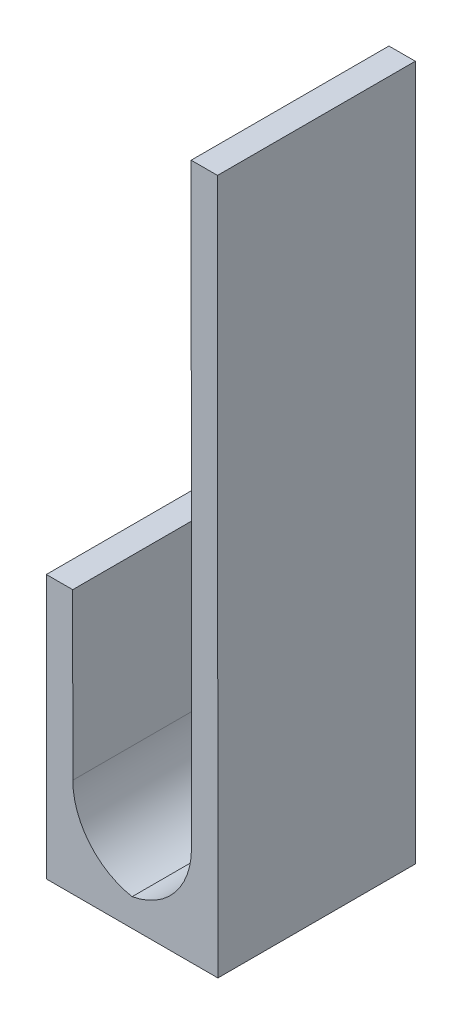
ISO-10303-21;
HEADER;
FILE_DESCRIPTION(('STEP AP214'),'2;1');
FILE_NAME('part.step','',(''),(''),'','','');
FILE_SCHEMA(('AUTOMOTIVE_DESIGN { 1 0 10303 214 1 1 1 1 }'));
ENDSEC;
DATA;
#1=APPLICATION_CONTEXT('core data for automotive mechanical design processes');
#2=APPLICATION_PROTOCOL_DEFINITION('international standard','automotive_design',2000,#1);
#3=PRODUCT_CONTEXT('',#1,'mechanical');
#4=PRODUCT('Part','Part','',(#3));
#5=PRODUCT_RELATED_PRODUCT_CATEGORY('part','',(#4));
#6=PRODUCT_DEFINITION_FORMATION('','',#4);
#7=PRODUCT_DEFINITION_CONTEXT('part definition',#1,'design');
#8=PRODUCT_DEFINITION('design','',#6,#7);
#9=PRODUCT_DEFINITION_SHAPE('','',#8);
#10=(LENGTH_UNIT() NAMED_UNIT(*) SI_UNIT(.MILLI.,.METRE.));
#11=(NAMED_UNIT(*) PLANE_ANGLE_UNIT() SI_UNIT($,.RADIAN.));
#12=(NAMED_UNIT(*) SI_UNIT($,.STERADIAN.) SOLID_ANGLE_UNIT());
#13=UNCERTAINTY_MEASURE_WITH_UNIT(LENGTH_MEASURE(1.E-05),#10,'distance_accuracy_value','');
#14=(GEOMETRIC_REPRESENTATION_CONTEXT(3) GLOBAL_UNCERTAINTY_ASSIGNED_CONTEXT((#13)) GLOBAL_UNIT_ASSIGNED_CONTEXT((#10,
#11,#12)) REPRESENTATION_CONTEXT('',''));
#15=CARTESIAN_POINT('',(0.,0.,0.));
#16=DIRECTION('',(0.,0.,1.));
#17=DIRECTION('',(1.,0.,0.));
#18=AXIS2_PLACEMENT_3D('',#15,#16,#17);
#19=CARTESIAN_POINT('',(0.,2.,15.));
#20=DIRECTION('',(1.,0.,0.));
#21=DIRECTION('',(0.,1.,0.));
#22=AXIS2_PLACEMENT_3D('',#19,#20,#21);
#23=PLANE('',#22);
#24=DIRECTION('',(0.,-1.,0.));
#25=VECTOR('',#24,1.);
#26=CARTESIAN_POINT('',(0.,2.,0.));
#27=LINE('',#26,#25);
#28=CARTESIAN_POINT('',(0.,2.,0.));
#29=VERTEX_POINT('',#28);
#30=CARTESIAN_POINT('',(0.,0.,0.));
#31=VERTEX_POINT('',#30);
#32=EDGE_CURVE('E141',#29,#31,#27,.T.);
#33=ORIENTED_EDGE('',*,*,#32,.T.);
#34=DIRECTION('',(0.,0.,-1.));
#35=VECTOR('',#34,1.);
#36=CARTESIAN_POINT('',(0.,0.,15.));
#37=LINE('',#36,#35);
#38=CARTESIAN_POINT('',(0.,0.,15.));
#39=VERTEX_POINT('',#38);
#40=EDGE_CURVE('E11',#39,#31,#37,.T.);
#41=ORIENTED_EDGE('',*,*,#40,.F.);
#42=DIRECTION('',(0.,-1.,0.));
#43=VECTOR('',#42,1.);
#44=CARTESIAN_POINT('',(0.,2.,15.));
#45=LINE('',#44,#43);
#46=CARTESIAN_POINT('',(0.,2.,15.));
#47=VERTEX_POINT('',#46);
#48=EDGE_CURVE('E159',#47,#39,#45,.T.);
#49=ORIENTED_EDGE('',*,*,#48,.F.);
#50=DIRECTION('',(0.,0.,-1.));
#51=VECTOR('',#50,1.);
#52=CARTESIAN_POINT('',(0.,2.,15.));
#53=LINE('',#52,#51);
#54=EDGE_CURVE('E137',#47,#29,#53,.T.);
#55=ORIENTED_EDGE('',*,*,#54,.T.);
#56=EDGE_LOOP('',(#33,#41,#49,#55));
#57=FACE_BOUND('',#56,.T.);
#58=ADVANCED_FACE('F33',(#57),#23,.F.);
#59=CARTESIAN_POINT('',(0.,0.,15.));
#60=DIRECTION('',(0.,1.,0.));
#61=DIRECTION('',(0.,0.,1.));
#62=AXIS2_PLACEMENT_3D('',#59,#60,#61);
#63=PLANE('',#62);
#64=DIRECTION('',(1.,0.,0.));
#65=VECTOR('',#64,1.);
#66=CARTESIAN_POINT('',(0.,0.,0.));
#67=LINE('',#66,#65);
#68=CARTESIAN_POINT('',(13.0010197288387,0.,0.));
#69=VERTEX_POINT('',#68);
#70=EDGE_CURVE('E144',#31,#69,#67,.T.);
#71=ORIENTED_EDGE('',*,*,#70,.T.);
#72=DIRECTION('',(0.,0.,-1.));
#73=VECTOR('',#72,1.);
#74=CARTESIAN_POINT('',(13.0010197288387,0.,15.));
#75=LINE('',#74,#73);
#76=CARTESIAN_POINT('',(13.0010197288387,0.,15.));
#77=VERTEX_POINT('',#76);
#78=EDGE_CURVE('E41',#77,#69,#75,.T.);
#79=ORIENTED_EDGE('',*,*,#78,.F.);
#80=DIRECTION('',(1.,0.,0.));
#81=VECTOR('',#80,1.);
#82=CARTESIAN_POINT('',(0.,0.,15.));
#83=LINE('',#82,#81);
#84=EDGE_CURVE('E98',#39,#77,#83,.T.);
#85=ORIENTED_EDGE('',*,*,#84,.F.);
#86=ORIENTED_EDGE('',*,*,#40,.T.);
#87=EDGE_LOOP('',(#71,#79,#85,#86));
#88=FACE_BOUND('',#87,.T.);
#89=ADVANCED_FACE('F208',(#88),#63,.F.);
#90=CARTESIAN_POINT('',(12.9741931542062,52.702156530039,15.));
#91=DIRECTION('',(-0.999999870448158,-0.000509022266324677,0.));
#92=DIRECTION('',(0.000509022266324677,-0.999999870448158,0.));
#93=AXIS2_PLACEMENT_3D('',#90,#91,#92);
#94=PLANE('',#93);
#95=DIRECTION('',(-0.000509022266324677,0.999999870448158,0.));
#96=VECTOR('',#95,1.);
#97=CARTESIAN_POINT('',(12.9741931542062,52.702156530039,0.));
#98=LINE('',#97,#96);
#99=CARTESIAN_POINT('',(12.9741931542062,52.702156530039,0.));
#100=VERTEX_POINT('',#99);
#101=EDGE_CURVE('E146',#69,#100,#98,.T.);
#102=ORIENTED_EDGE('',*,*,#101,.T.);
#103=DIRECTION('',(0.,0.,-1.));
#104=VECTOR('',#103,1.);
#105=CARTESIAN_POINT('',(12.9741931542062,52.702156530039,15.));
#106=LINE('',#105,#104);
#107=CARTESIAN_POINT('',(12.9741931542062,52.702156530039,15.));
#108=VERTEX_POINT('',#107);
#109=EDGE_CURVE('E172',#108,#100,#106,.T.);
#110=ORIENTED_EDGE('',*,*,#109,.F.);
#111=DIRECTION('',(-0.000509022266324677,0.999999870448158,0.));
#112=VECTOR('',#111,1.);
#113=CARTESIAN_POINT('',(12.9741931542062,52.702156530039,15.));
#114=LINE('',#113,#112);
#115=EDGE_CURVE('E180',#77,#108,#114,.T.);
#116=ORIENTED_EDGE('',*,*,#115,.F.);
#117=ORIENTED_EDGE('',*,*,#78,.T.);
#118=EDGE_LOOP('',(#102,#110,#116,#117));
#119=FACE_BOUND('',#118,.T.);
#120=ADVANCED_FACE('F178',(#119),#94,.F.);
#121=CARTESIAN_POINT('',(10.9741934133098,52.7011384855064,15.));
#122=DIRECTION('',(0.000509022266323433,-0.999999870448158,0.));
#123=DIRECTION('',(0.999999870448158,0.000509022266323433,0.));
#124=AXIS2_PLACEMENT_3D('',#121,#122,#123);
#125=PLANE('',#124);
#126=DIRECTION('',(-0.999999870448158,-0.000509022266323433,0.));
#127=VECTOR('',#126,1.);
#128=CARTESIAN_POINT('',(10.9741934133098,52.7011384855064,0.));
#129=LINE('',#128,#127);
#130=CARTESIAN_POINT('',(10.9741934133098,52.7011384855064,0.));
#131=VERTEX_POINT('',#130);
#132=EDGE_CURVE('E148',#100,#131,#129,.T.);
#133=ORIENTED_EDGE('',*,*,#132,.T.);
#134=DIRECTION('',(0.,0.,-1.));
#135=VECTOR('',#134,1.);
#136=CARTESIAN_POINT('',(10.9741934133098,52.7011384855064,15.));
#137=LINE('',#136,#135);
#138=CARTESIAN_POINT('',(10.9741934133098,52.7011384855064,15.));
#139=VERTEX_POINT('',#138);
#140=EDGE_CURVE('E169',#139,#131,#137,.T.);
#141=ORIENTED_EDGE('',*,*,#140,.F.);
#142=DIRECTION('',(-0.999999870448158,-0.000509022266323433,0.));
#143=VECTOR('',#142,1.);
#144=CARTESIAN_POINT('',(10.9741934133098,52.7011384855064,15.));
#145=LINE('',#144,#143);
#146=EDGE_CURVE('E198',#108,#139,#145,.T.);
#147=ORIENTED_EDGE('',*,*,#146,.F.);
#148=ORIENTED_EDGE('',*,*,#109,.T.);
#149=EDGE_LOOP('',(#133,#141,#147,#148));
#150=FACE_BOUND('',#149,.T.);
#151=ADVANCED_FACE('F189',(#150),#125,.F.);
#152=CARTESIAN_POINT('',(10.9741934133098,52.7011384855064,15.));
#153=DIRECTION('',(0.999999870448158,0.000509022266324761,0.));
#154=DIRECTION('',(-0.000509022266324761,0.999999870448158,0.));
#155=AXIS2_PLACEMENT_3D('',#152,#153,#154);
#156=PLANE('',#155);
#157=DIRECTION('',(0.000509022266324761,-0.999999870448158,0.));
#158=VECTOR('',#157,1.);
#159=CARTESIAN_POINT('',(10.9741934133098,52.7011384855064,0.));
#160=LINE('',#159,#158);
#161=CARTESIAN_POINT('',(10.9972046771542,7.49435209220371,0.));
#162=VERTEX_POINT('',#161);
#163=EDGE_CURVE('E150',#131,#162,#160,.T.);
#164=ORIENTED_EDGE('',*,*,#163,.T.);
#165=DIRECTION('',(0.,0.,-1.));
#166=VECTOR('',#165,1.);
#167=CARTESIAN_POINT('',(10.9972046771542,7.49435209220371,15.));
#168=LINE('',#167,#166);
#169=CARTESIAN_POINT('',(10.9972046771542,7.49435209220371,15.));
#170=VERTEX_POINT('',#169);
#171=EDGE_CURVE('E166',#170,#162,#168,.T.);
#172=ORIENTED_EDGE('',*,*,#171,.F.);
#173=DIRECTION('',(0.000509022266324761,-0.999999870448158,0.));
#174=VECTOR('',#173,1.);
#175=CARTESIAN_POINT('',(10.9741934133098,52.7011384855064,15.));
#176=LINE('',#175,#174);
#177=EDGE_CURVE('E195',#139,#170,#176,.T.);
#178=ORIENTED_EDGE('',*,*,#177,.F.);
#179=ORIENTED_EDGE('',*,*,#140,.T.);
#180=EDGE_LOOP('',(#164,#172,#178,#179));
#181=FACE_BOUND('',#180,.T.);
#182=ADVANCED_FACE('F193',(#181),#156,.F.);
#183=CARTESIAN_POINT('',(5.50564862106321,7.49155676753225,15.));
#184=DIRECTION('',(0.,0.,-1.));
#185=DIRECTION('',(-1.,0.,0.));
#186=AXIS2_PLACEMENT_3D('',#183,#184,#185);
#187=CYLINDRICAL_SURFACE('',#186,5.49155676753225);
#188=CARTESIAN_POINT('',(5.50564862106321,7.49155676753225,0.));
#189=DIRECTION('',(0.,0.,-1.));
#190=DIRECTION('',(-1.,0.,0.));
#191=AXIS2_PLACEMENT_3D('',#188,#189,#190);
#192=CIRCLE('',#191,5.49155676753225);
#193=CARTESIAN_POINT('',(6.49720551705349,2.09025964063362,0.));
#194=VERTEX_POINT('',#193);
#195=EDGE_CURVE('E152',#162,#194,#192,.T.);
#196=ORIENTED_EDGE('',*,*,#195,.T.);
#197=DIRECTION('',(0.,0.,-1.));
#198=VECTOR('',#197,1.);
#199=CARTESIAN_POINT('',(6.49720551705349,2.09025964063362,15.));
#200=LINE('',#199,#198);
#201=CARTESIAN_POINT('',(6.49720551705349,2.09025964063362,15.));
#202=VERTEX_POINT('',#201);
#203=EDGE_CURVE('E163',#202,#194,#200,.T.);
#204=ORIENTED_EDGE('',*,*,#203,.F.);
#205=CARTESIAN_POINT('',(5.50564862106321,7.49155676753225,15.));
#206=DIRECTION('',(0.,0.,-1.));
#207=DIRECTION('',(-1.,0.,0.));
#208=AXIS2_PLACEMENT_3D('',#205,#206,#207);
#209=CIRCLE('',#208,5.49155676753225);
#210=EDGE_CURVE('E197',#170,#202,#209,.T.);
#211=ORIENTED_EDGE('',*,*,#210,.F.);
#212=ORIENTED_EDGE('',*,*,#171,.T.);
#213=EDGE_LOOP('',(#196,#204,#211,#212));
#214=FACE_BOUND('',#213,.T.);
#215=ADVANCED_FACE('F220',(#214),#187,.F.);
#216=CARTESIAN_POINT('',(7.48876241304376,7.49155676753225,15.));
#217=DIRECTION('',(0.,0.,-1.));
#218=DIRECTION('',(-1.,0.,0.));
#219=AXIS2_PLACEMENT_3D('',#216,#217,#218);
#220=CYLINDRICAL_SURFACE('',#219,5.49155676753225);
#221=CARTESIAN_POINT('',(7.48876241304376,7.49155676753225,0.));
#222=DIRECTION('',(0.,0.,-1.));
#223=DIRECTION('',(1.,0.,0.));
#224=AXIS2_PLACEMENT_3D('',#221,#222,#223);
#225=CIRCLE('',#224,5.49155676753225);
#226=CARTESIAN_POINT('',(1.9972063569528,7.4887614428608,0.));
#227=VERTEX_POINT('',#226);
#228=EDGE_CURVE('E154',#194,#227,#225,.T.);
#229=ORIENTED_EDGE('',*,*,#228,.T.);
#230=DIRECTION('',(0.,0.,-1.));
#231=VECTOR('',#230,1.);
#232=CARTESIAN_POINT('',(1.9972063569528,7.4887614428608,15.));
#233=LINE('',#232,#231);
#234=CARTESIAN_POINT('',(1.9972063569528,7.4887614428608,15.));
#235=VERTEX_POINT('',#234);
#236=EDGE_CURVE('E132',#235,#227,#233,.T.);
#237=ORIENTED_EDGE('',*,*,#236,.F.);
#238=CARTESIAN_POINT('',(7.48876241304376,7.49155676753225,15.));
#239=DIRECTION('',(0.,0.,-1.));
#240=DIRECTION('',(1.,0.,0.));
#241=AXIS2_PLACEMENT_3D('',#238,#239,#240);
#242=CIRCLE('',#241,5.49155676753225);
#243=EDGE_CURVE('E123',#202,#235,#242,.T.);
#244=ORIENTED_EDGE('',*,*,#243,.F.);
#245=ORIENTED_EDGE('',*,*,#203,.T.);
#246=EDGE_LOOP('',(#229,#237,#244,#245));
#247=FACE_BOUND('',#246,.T.);
#248=ADVANCED_FACE('F223',(#247),#220,.F.);
#249=CARTESIAN_POINT('',(1.9972063569528,7.48876144286079,15.));
#250=DIRECTION('',(-0.999999870448158,-0.000509022266324619,0.));
#251=DIRECTION('',(0.000509022266324619,-0.999999870448158,0.));
#252=AXIS2_PLACEMENT_3D('',#249,#250,#251);
#253=PLANE('',#252);
#254=DIRECTION('',(-0.000509022266324619,0.999999870448158,0.));
#255=VECTOR('',#254,1.);
#256=CARTESIAN_POINT('',(1.9972063569528,7.48876144286079,0.));
#257=LINE('',#256,#255);
#258=CARTESIAN_POINT('',(1.99083734010247,20.0010157125995,0.));
#259=VERTEX_POINT('',#258);
#260=EDGE_CURVE('E131',#227,#259,#257,.T.);
#261=ORIENTED_EDGE('',*,*,#260,.T.);
#262=DIRECTION('',(0.,0.,-1.));
#263=VECTOR('',#262,1.);
#264=CARTESIAN_POINT('',(1.99083734010247,20.0010157125995,15.));
#265=LINE('',#264,#263);
#266=CARTESIAN_POINT('',(1.99083734010247,20.0010157125995,15.));
#267=VERTEX_POINT('',#266);
#268=EDGE_CURVE('E128',#267,#259,#265,.T.);
#269=ORIENTED_EDGE('',*,*,#268,.F.);
#270=DIRECTION('',(-0.000509022266324619,0.999999870448158,0.));
#271=VECTOR('',#270,1.);
#272=CARTESIAN_POINT('',(1.9972063569528,7.48876144286079,15.));
#273=LINE('',#272,#271);
#274=EDGE_CURVE('E117',#235,#267,#273,.T.);
#275=ORIENTED_EDGE('',*,*,#274,.F.);
#276=ORIENTED_EDGE('',*,*,#236,.T.);
#277=EDGE_LOOP('',(#261,#269,#275,#276));
#278=FACE_BOUND('',#277,.T.);
#279=ADVANCED_FACE('F129',(#278),#253,.F.);
#280=CARTESIAN_POINT('',(1.99083734010247,20.0010157125995,15.));
#281=DIRECTION('',(0.000509022266326903,-0.999999870448158,0.));
#282=DIRECTION('',(0.999999870448158,0.000509022266326903,0.));
#283=AXIS2_PLACEMENT_3D('',#280,#281,#282);
#284=PLANE('',#283);
#285=DIRECTION('',(-0.999999870448158,-0.000509022266326903,0.));
#286=VECTOR('',#285,1.);
#287=CARTESIAN_POINT('',(1.99083734010247,20.0010157125995,0.));
#288=LINE('',#287,#286);
#289=CARTESIAN_POINT('',(-0.00916240079384357,19.9999976680668,0.));
#290=VERTEX_POINT('',#289);
#291=EDGE_CURVE('E84',#259,#290,#288,.T.);
#292=ORIENTED_EDGE('',*,*,#291,.T.);
#293=DIRECTION('',(0.,0.,-1.));
#294=VECTOR('',#293,1.);
#295=CARTESIAN_POINT('',(-0.00916240079384357,19.9999976680668,15.));
#296=LINE('',#295,#294);
#297=CARTESIAN_POINT('',(-0.00916240079384357,19.9999976680668,15.));
#298=VERTEX_POINT('',#297);
#299=EDGE_CURVE('E133',#298,#290,#296,.T.);
#300=ORIENTED_EDGE('',*,*,#299,.F.);
#301=DIRECTION('',(-0.999999870448158,-0.000509022266326903,0.));
#302=VECTOR('',#301,1.);
#303=CARTESIAN_POINT('',(1.99083734010247,20.0010157125995,15.));
#304=LINE('',#303,#302);
#305=EDGE_CURVE('E121',#267,#298,#304,.T.);
#306=ORIENTED_EDGE('',*,*,#305,.F.);
#307=ORIENTED_EDGE('',*,*,#268,.T.);
#308=EDGE_LOOP('',(#292,#300,#306,#307));
#309=FACE_BOUND('',#308,.T.);
#310=ADVANCED_FACE('F135',(#309),#284,.F.);
#311=CARTESIAN_POINT('',(0.,2.,15.));
#312=DIRECTION('',(0.999999870448158,0.000509022266324647,0.));
#313=DIRECTION('',(-0.000509022266324647,0.999999870448158,0.));
#314=AXIS2_PLACEMENT_3D('',#311,#312,#313);
#315=PLANE('',#314);
#316=DIRECTION('',(0.000509022266324647,-0.999999870448158,0.));
#317=VECTOR('',#316,1.);
#318=CARTESIAN_POINT('',(0.,2.,0.));
#319=LINE('',#318,#317);
#320=EDGE_CURVE('E90',#290,#29,#319,.T.);
#321=ORIENTED_EDGE('',*,*,#320,.T.);
#322=ORIENTED_EDGE('',*,*,#54,.F.);
#323=DIRECTION('',(0.000509022266324647,-0.999999870448158,0.));
#324=VECTOR('',#323,1.);
#325=CARTESIAN_POINT('',(0.,2.,15.));
#326=LINE('',#325,#324);
#327=EDGE_CURVE('E49',#298,#47,#326,.T.);
#328=ORIENTED_EDGE('',*,*,#327,.F.);
#329=ORIENTED_EDGE('',*,*,#299,.T.);
#330=EDGE_LOOP('',(#321,#322,#328,#329));
#331=FACE_BOUND('',#330,.T.);
#332=ADVANCED_FACE('F232',(#331),#315,.F.);
#333=CARTESIAN_POINT('',(5.50564862106321,7.49155676753225,15.));
#334=DIRECTION('',(0.,0.,-1.));
#335=DIRECTION('',(-1.,0.,0.));
#336=AXIS2_PLACEMENT_3D('',#333,#334,#335);
#337=PLANE('',#336);
#338=ORIENTED_EDGE('',*,*,#48,.T.);
#339=ORIENTED_EDGE('',*,*,#84,.T.);
#340=ORIENTED_EDGE('',*,*,#115,.T.);
#341=ORIENTED_EDGE('',*,*,#146,.T.);
#342=ORIENTED_EDGE('',*,*,#177,.T.);
#343=ORIENTED_EDGE('',*,*,#210,.T.);
#344=ORIENTED_EDGE('',*,*,#243,.T.);
#345=ORIENTED_EDGE('',*,*,#274,.T.);
#346=ORIENTED_EDGE('',*,*,#305,.T.);
#347=ORIENTED_EDGE('',*,*,#327,.T.);
#348=EDGE_LOOP('',(#338,#339,#340,#341,#342,#343,#344,#345,#346,#347));
#349=FACE_BOUND('',#348,.T.);
#350=ADVANCED_FACE('F119',(#349),#337,.F.);
#351=CARTESIAN_POINT('',(5.50564862106321,7.49155676753225,0.));
#352=DIRECTION('',(0.,0.,-1.));
#353=DIRECTION('',(-1.,0.,0.));
#354=AXIS2_PLACEMENT_3D('',#351,#352,#353);
#355=PLANE('',#354);
#356=ORIENTED_EDGE('',*,*,#32,.F.);
#357=ORIENTED_EDGE('',*,*,#320,.F.);
#358=ORIENTED_EDGE('',*,*,#291,.F.);
#359=ORIENTED_EDGE('',*,*,#260,.F.);
#360=ORIENTED_EDGE('',*,*,#228,.F.);
#361=ORIENTED_EDGE('',*,*,#195,.F.);
#362=ORIENTED_EDGE('',*,*,#163,.F.);
#363=ORIENTED_EDGE('',*,*,#132,.F.);
#364=ORIENTED_EDGE('',*,*,#101,.F.);
#365=ORIENTED_EDGE('',*,*,#70,.F.);
#366=EDGE_LOOP('',(#356,#357,#358,#359,#360,#361,#362,#363,#364,#365));
#367=FACE_BOUND('',#366,.T.);
#368=ADVANCED_FACE('F184',(#367),#355,.T.);
#369=CLOSED_SHELL('',(#58,#89,#120,#151,#182,#215,#248,#279,#310,#332,#350,#368));
#370=MANIFOLD_SOLID_BREP('B2',#369);
#371=ADVANCED_BREP_SHAPE_REPRESENTATION('',(#18,#370),#14);
#372=SHAPE_DEFINITION_REPRESENTATION(#9,#371);
ENDSEC;
END-ISO-10303-21;
